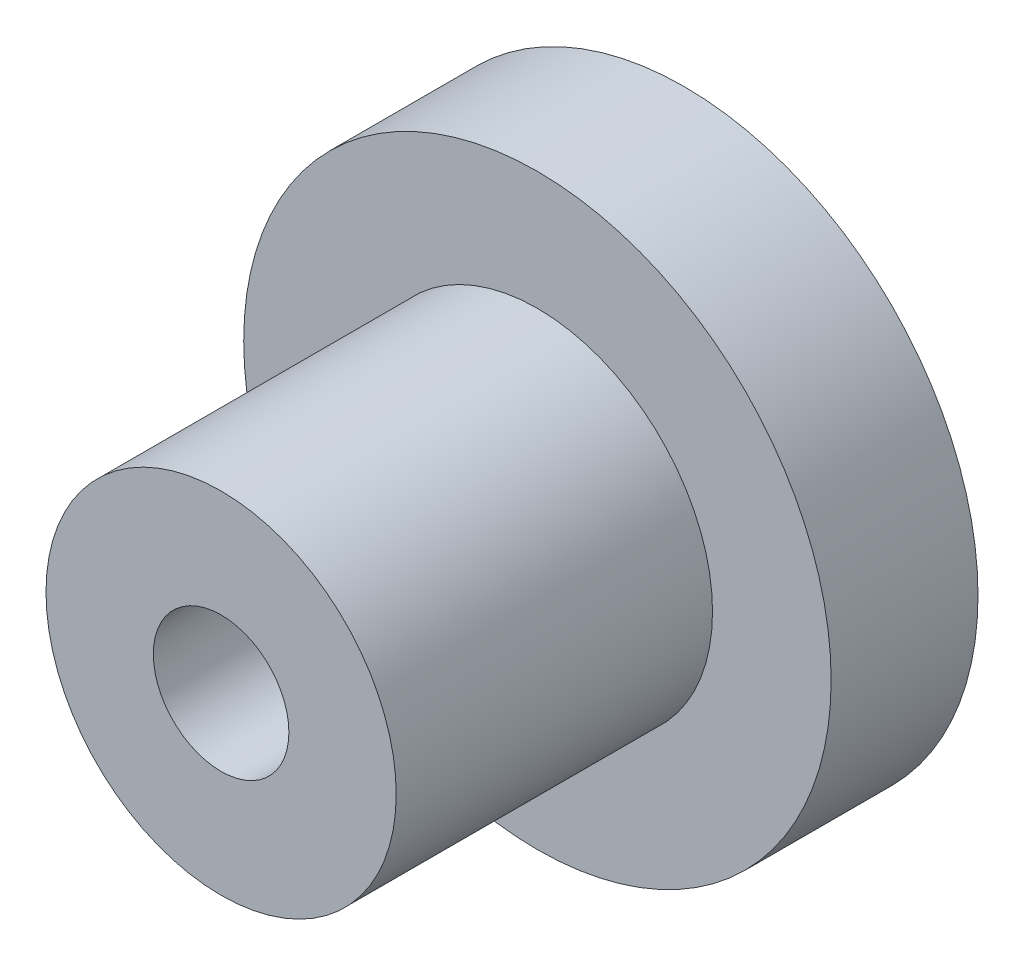
ISO-10303-21;
HEADER;
FILE_DESCRIPTION(('STEP AP214'),'2;1');
FILE_NAME('part.step','',(''),(''),'','','');
FILE_SCHEMA(('AUTOMOTIVE_DESIGN { 1 0 10303 214 1 1 1 1 }'));
ENDSEC;
DATA;
#1=APPLICATION_CONTEXT('core data for automotive mechanical design processes');
#2=APPLICATION_PROTOCOL_DEFINITION('international standard','automotive_design',2000,#1);
#3=PRODUCT_CONTEXT('',#1,'mechanical');
#4=PRODUCT('Part','Part','',(#3));
#5=PRODUCT_RELATED_PRODUCT_CATEGORY('part','',(#4));
#6=PRODUCT_DEFINITION_FORMATION('','',#4);
#7=PRODUCT_DEFINITION_CONTEXT('part definition',#1,'design');
#8=PRODUCT_DEFINITION('design','',#6,#7);
#9=PRODUCT_DEFINITION_SHAPE('','',#8);
#10=(LENGTH_UNIT() NAMED_UNIT(*) SI_UNIT(.MILLI.,.METRE.));
#11=(NAMED_UNIT(*) PLANE_ANGLE_UNIT() SI_UNIT($,.RADIAN.));
#12=(NAMED_UNIT(*) SI_UNIT($,.STERADIAN.) SOLID_ANGLE_UNIT());
#13=UNCERTAINTY_MEASURE_WITH_UNIT(LENGTH_MEASURE(1.E-05),#10,'distance_accuracy_value','');
#14=(GEOMETRIC_REPRESENTATION_CONTEXT(3) GLOBAL_UNCERTAINTY_ASSIGNED_CONTEXT((#13)) GLOBAL_UNIT_ASSIGNED_CONTEXT((#10,
#11,#12)) REPRESENTATION_CONTEXT('',''));
#15=CARTESIAN_POINT('',(0.,0.,0.));
#16=DIRECTION('',(0.,0.,1.));
#17=DIRECTION('',(1.,0.,0.));
#18=AXIS2_PLACEMENT_3D('',#15,#16,#17);
#19=CARTESIAN_POINT('',(0.,0.,7.));
#20=DIRECTION('',(0.,0.,1.));
#21=DIRECTION('',(1.,0.,0.));
#22=AXIS2_PLACEMENT_3D('',#19,#20,#21);
#23=PLANE('',#22);
#24=CARTESIAN_POINT('',(0.,0.,7.));
#25=DIRECTION('',(0.,0.,1.));
#26=DIRECTION('',(1.,0.,0.));
#27=AXIS2_PLACEMENT_3D('',#24,#25,#26);
#28=CIRCLE('',#27,3.875);
#29=CARTESIAN_POINT('',(3.875,0.,7.));
#30=VERTEX_POINT('',#29);
#31=EDGE_CURVE('E10',#30,#30,#28,.T.);
#32=ORIENTED_EDGE('',*,*,#31,.T.);
#33=EDGE_LOOP('',(#32));
#34=FACE_BOUND('',#33,.T.);
#35=CARTESIAN_POINT('',(0.,0.,7.));
#36=DIRECTION('',(0.,0.,1.));
#37=DIRECTION('',(1.,0.,0.));
#38=AXIS2_PLACEMENT_3D('',#35,#36,#37);
#39=CIRCLE('',#38,1.5);
#40=CARTESIAN_POINT('',(1.5,0.,7.));
#41=VERTEX_POINT('',#40);
#42=EDGE_CURVE('E39',#41,#41,#39,.T.);
#43=ORIENTED_EDGE('',*,*,#42,.F.);
#44=EDGE_LOOP('',(#43));
#45=FACE_BOUND('',#44,.T.);
#46=ADVANCED_FACE('F31',(#34,#45),#23,.T.);
#47=CARTESIAN_POINT('',(0.,0.,7.));
#48=DIRECTION('',(0.,0.,-1.));
#49=DIRECTION('',(-1.,0.,0.));
#50=AXIS2_PLACEMENT_3D('',#47,#48,#49);
#51=CYLINDRICAL_SURFACE('',#50,3.875);
#52=ORIENTED_EDGE('',*,*,#31,.F.);
#53=EDGE_LOOP('',(#52));
#54=FACE_BOUND('',#53,.T.);
#55=CARTESIAN_POINT('',(0.,0.,0.));
#56=DIRECTION('',(0.,0.,1.));
#57=DIRECTION('',(1.,0.,0.));
#58=AXIS2_PLACEMENT_3D('',#55,#56,#57);
#59=CIRCLE('',#58,3.875);
#60=CARTESIAN_POINT('',(3.875,0.,0.));
#61=VERTEX_POINT('',#60);
#62=EDGE_CURVE('E35',#61,#61,#59,.T.);
#63=ORIENTED_EDGE('',*,*,#62,.T.);
#64=EDGE_LOOP('',(#63));
#65=FACE_BOUND('',#64,.T.);
#66=ADVANCED_FACE('F33',(#54,#65),#51,.T.);
#67=CARTESIAN_POINT('',(0.,0.,7.));
#68=DIRECTION('',(0.,0.,-1.));
#69=DIRECTION('',(-1.,0.,0.));
#70=AXIS2_PLACEMENT_3D('',#67,#68,#69);
#71=CYLINDRICAL_SURFACE('',#70,1.5);
#72=ORIENTED_EDGE('',*,*,#42,.T.);
#73=EDGE_LOOP('',(#72));
#74=FACE_BOUND('',#73,.T.);
#75=CARTESIAN_POINT('',(0.,0.,-3.25));
#76=DIRECTION('',(0.,0.,-1.));
#77=DIRECTION('',(-1.,0.,0.));
#78=AXIS2_PLACEMENT_3D('',#75,#76,#77);
#79=CIRCLE('',#78,1.5);
#80=CARTESIAN_POINT('',(-1.5,0.,-3.25));
#81=VERTEX_POINT('',#80);
#82=EDGE_CURVE('E49',#81,#81,#79,.T.);
#83=ORIENTED_EDGE('',*,*,#82,.T.);
#84=EDGE_LOOP('',(#83));
#85=FACE_BOUND('',#84,.T.);
#86=ADVANCED_FACE('F55',(#74,#85),#71,.F.);
#87=CARTESIAN_POINT('',(0.,0.,-3.25));
#88=DIRECTION('',(0.,0.,-1.));
#89=DIRECTION('',(-1.,0.,0.));
#90=AXIS2_PLACEMENT_3D('',#87,#88,#89);
#91=PLANE('',#90);
#92=CARTESIAN_POINT('',(0.,0.,-3.25));
#93=DIRECTION('',(0.,0.,-1.));
#94=DIRECTION('',(-1.,0.,0.));
#95=AXIS2_PLACEMENT_3D('',#92,#93,#94);
#96=CIRCLE('',#95,6.5);
#97=CARTESIAN_POINT('',(6.5,0.,-3.25));
#98=VERTEX_POINT('',#97);
#99=EDGE_CURVE('E48',#98,#98,#96,.T.);
#100=ORIENTED_EDGE('',*,*,#99,.T.);
#101=EDGE_LOOP('',(#100));
#102=FACE_BOUND('',#101,.T.);
#103=ORIENTED_EDGE('',*,*,#82,.F.);
#104=EDGE_LOOP('',(#103));
#105=FACE_BOUND('',#104,.T.);
#106=ADVANCED_FACE('F57',(#102,#105),#91,.T.);
#107=CARTESIAN_POINT('',(0.,0.,0.));
#108=DIRECTION('',(0.,0.,-1.));
#109=DIRECTION('',(-1.,0.,0.));
#110=AXIS2_PLACEMENT_3D('',#107,#108,#109);
#111=PLANE('',#110);
#112=ORIENTED_EDGE('',*,*,#62,.F.);
#113=EDGE_LOOP('',(#112));
#114=FACE_BOUND('',#113,.T.);
#115=CARTESIAN_POINT('',(0.,0.,0.));
#116=DIRECTION('',(0.,0.,-1.));
#117=DIRECTION('',(-1.,0.,0.));
#118=AXIS2_PLACEMENT_3D('',#115,#116,#117);
#119=CIRCLE('',#118,6.5);
#120=CARTESIAN_POINT('',(6.5,0.,0.));
#121=VERTEX_POINT('',#120);
#122=EDGE_CURVE('E45',#121,#121,#119,.T.);
#123=ORIENTED_EDGE('',*,*,#122,.F.);
#124=EDGE_LOOP('',(#123));
#125=FACE_BOUND('',#124,.T.);
#126=ADVANCED_FACE('F59',(#114,#125),#111,.F.);
#127=CARTESIAN_POINT('',(0.,0.,-3.25));
#128=DIRECTION('',(0.,0.,1.));
#129=DIRECTION('',(1.,0.,0.));
#130=AXIS2_PLACEMENT_3D('',#127,#128,#129);
#131=CYLINDRICAL_SURFACE('',#130,6.5);
#132=CARTESIAN_POINT('',(6.5,0.,-3.25));
#133=CARTESIAN_POINT('',(6.5,0.,-3.21614583333333));
#134=CARTESIAN_POINT('',(6.5,0.,-3.18229166666667));
#135=CARTESIAN_POINT('',(6.5,0.,-3.11458333333333));
#136=CARTESIAN_POINT('',(6.5,0.,-3.08072916666667));
#137=CARTESIAN_POINT('',(6.5,0.,-3.01302083333333));
#138=CARTESIAN_POINT('',(6.5,0.,-2.97916666666667));
#139=CARTESIAN_POINT('',(6.5,0.,-2.91145833333333));
#140=CARTESIAN_POINT('',(6.5,0.,-2.87760416666667));
#141=CARTESIAN_POINT('',(6.5,0.,-2.80989583333333));
#142=CARTESIAN_POINT('',(6.5,0.,-2.77604166666667));
#143=CARTESIAN_POINT('',(6.5,0.,-2.70833333333333));
#144=CARTESIAN_POINT('',(6.5,0.,-2.67447916666667));
#145=CARTESIAN_POINT('',(6.5,0.,-2.60677083333333));
#146=CARTESIAN_POINT('',(6.5,0.,-2.57291666666667));
#147=CARTESIAN_POINT('',(6.5,0.,-2.50520833333333));
#148=CARTESIAN_POINT('',(6.5,0.,-2.47135416666667));
#149=CARTESIAN_POINT('',(6.5,0.,-2.40364583333333));
#150=CARTESIAN_POINT('',(6.5,0.,-2.36979166666667));
#151=CARTESIAN_POINT('',(6.5,0.,-2.30208333333333));
#152=CARTESIAN_POINT('',(6.5,0.,-2.26822916666667));
#153=CARTESIAN_POINT('',(6.5,0.,-2.20052083333333));
#154=CARTESIAN_POINT('',(6.5,0.,-2.16666666666667));
#155=CARTESIAN_POINT('',(6.5,0.,-2.09895833333333));
#156=CARTESIAN_POINT('',(6.5,0.,-2.06510416666667));
#157=CARTESIAN_POINT('',(6.5,0.,-1.99739583333333));
#158=CARTESIAN_POINT('',(6.5,0.,-1.96354166666667));
#159=CARTESIAN_POINT('',(6.5,0.,-1.89583333333333));
#160=CARTESIAN_POINT('',(6.5,0.,-1.86197916666667));
#161=CARTESIAN_POINT('',(6.5,0.,-1.79427083333333));
#162=CARTESIAN_POINT('',(6.5,0.,-1.76041666666667));
#163=CARTESIAN_POINT('',(6.5,0.,-1.69270833333333));
#164=CARTESIAN_POINT('',(6.5,0.,-1.65885416666667));
#165=CARTESIAN_POINT('',(6.5,0.,-1.59114583333333));
#166=CARTESIAN_POINT('',(6.5,0.,-1.55729166666667));
#167=CARTESIAN_POINT('',(6.5,0.,-1.48958333333333));
#168=CARTESIAN_POINT('',(6.5,0.,-1.45572916666667));
#169=CARTESIAN_POINT('',(6.5,0.,-1.38802083333333));
#170=CARTESIAN_POINT('',(6.5,0.,-1.35416666666667));
#171=CARTESIAN_POINT('',(6.5,0.,-1.28645833333333));
#172=CARTESIAN_POINT('',(6.5,0.,-1.25260416666667));
#173=CARTESIAN_POINT('',(6.5,0.,-1.18489583333333));
#174=CARTESIAN_POINT('',(6.5,0.,-1.15104166666667));
#175=CARTESIAN_POINT('',(6.5,0.,-1.08333333333333));
#176=CARTESIAN_POINT('',(6.5,0.,-1.04947916666667));
#177=CARTESIAN_POINT('',(6.5,0.,-0.981770833333333));
#178=CARTESIAN_POINT('',(6.5,0.,-0.947916666666667));
#179=CARTESIAN_POINT('',(6.5,0.,-0.880208333333333));
#180=CARTESIAN_POINT('',(6.5,0.,-0.846354166666667));
#181=CARTESIAN_POINT('',(6.5,0.,-0.778645833333333));
#182=CARTESIAN_POINT('',(6.5,0.,-0.744791666666667));
#183=CARTESIAN_POINT('',(6.5,0.,-0.677083333333333));
#184=CARTESIAN_POINT('',(6.5,0.,-0.643229166666667));
#185=CARTESIAN_POINT('',(6.5,0.,-0.575520833333333));
#186=CARTESIAN_POINT('',(6.5,0.,-0.541666666666667));
#187=CARTESIAN_POINT('',(6.5,0.,-0.473958333333333));
#188=CARTESIAN_POINT('',(6.5,0.,-0.440104166666667));
#189=CARTESIAN_POINT('',(6.5,0.,-0.372395833333333));
#190=CARTESIAN_POINT('',(6.5,0.,-0.338541666666667));
#191=CARTESIAN_POINT('',(6.5,0.,-0.270833333333333));
#192=CARTESIAN_POINT('',(6.5,0.,-0.236979166666667));
#193=CARTESIAN_POINT('',(6.5,0.,-0.169270833333333));
#194=CARTESIAN_POINT('',(6.5,0.,-0.135416666666667));
#195=CARTESIAN_POINT('',(6.5,0.,-0.0677083333333334));
#196=CARTESIAN_POINT('',(6.5,0.,-0.0338541666666667));
#197=CARTESIAN_POINT('',(6.5,0.,0.));
#198=B_SPLINE_CURVE_WITH_KNOTS('',3,(#132,#133,#134,#135,#136,#137,#138,#139,#140,#141,#142,
#143,#144,#145,#146,#147,#148,#149,#150,#151,#152,#153,#154,#155,#156,#157,#158,#159,#160,#161,
#162,#163,#164,#165,#166,#167,#168,#169,#170,#171,#172,#173,#174,#175,#176,#177,#178,#179,#180,
#181,#182,#183,#184,#185,#186,#187,#188,#189,#190,#191,#192,#193,#194,#195,#196,#197),
.UNSPECIFIED.,.F.,.F.,(4,2,2,2,2,2,2,2,2,2,2,2,2,2,2,2,2,2,2,2,2,2,2,2,2,2,2,2,2,2,2,2,4),(0.,
0.1015625,0.203125,0.3046875,0.40625,0.5078125,0.609375,0.7109375,0.8125,0.9140625,1.015625,
1.1171875,1.21875,1.3203125,1.421875,1.5234375,1.625,1.7265625,1.828125,1.9296875,2.03125,
2.1328125,2.234375,2.3359375,2.4375,2.5390625,2.640625,2.7421875,2.84375,2.9453125,3.046875,
3.1484375,3.25),.UNSPECIFIED.);
#199=EDGE_CURVE('BSEAM66',#98,#121,#198,.T.);
#200=ORIENTED_EDGE('',*,*,#99,.F.);
#201=ORIENTED_EDGE('',*,*,#122,.T.);
#202=ORIENTED_EDGE('',*,*,#199,.T.);
#203=ORIENTED_EDGE('',*,*,#199,.F.);
#204=EDGE_LOOP('',(#200,#202,#201,#203));
#205=FACE_BOUND('',#204,.T.);
#206=ADVANCED_FACE('F66',(#205),#131,.T.);
#207=CLOSED_SHELL('',(#46,#66,#86,#106,#126,#206));
#208=MANIFOLD_SOLID_BREP('B2',#207);
#209=ADVANCED_BREP_SHAPE_REPRESENTATION('',(#18,#208),#14);
#210=SHAPE_DEFINITION_REPRESENTATION(#9,#209);
ENDSEC;
END-ISO-10303-21;
